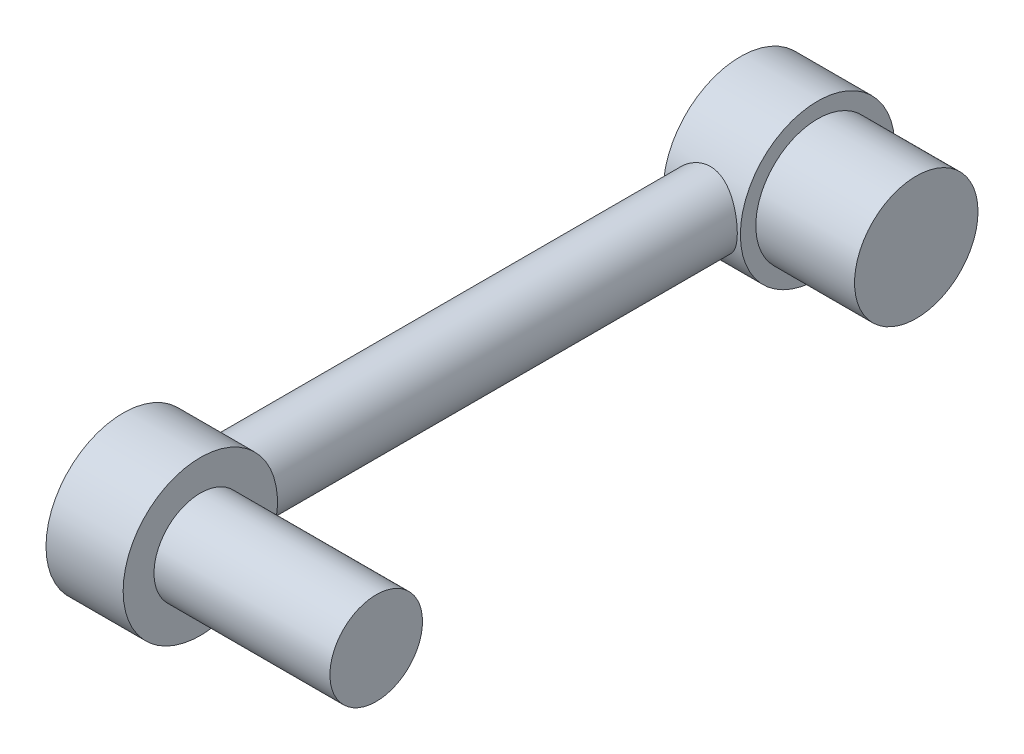
ISO-10303-21;
HEADER;
FILE_DESCRIPTION(('STEP AP214'),'2;1');
FILE_NAME('part.step','',(''),(''),'','','');
FILE_SCHEMA(('AUTOMOTIVE_DESIGN { 1 0 10303 214 1 1 1 1 }'));
ENDSEC;
DATA;
#1=APPLICATION_CONTEXT('core data for automotive mechanical design processes');
#2=APPLICATION_PROTOCOL_DEFINITION('international standard','automotive_design',2000,#1);
#3=PRODUCT_CONTEXT('',#1,'mechanical');
#4=PRODUCT('Part','Part','',(#3));
#5=PRODUCT_RELATED_PRODUCT_CATEGORY('part','',(#4));
#6=PRODUCT_DEFINITION_FORMATION('','',#4);
#7=PRODUCT_DEFINITION_CONTEXT('part definition',#1,'design');
#8=PRODUCT_DEFINITION('design','',#6,#7);
#9=PRODUCT_DEFINITION_SHAPE('','',#8);
#10=(LENGTH_UNIT() NAMED_UNIT(*) SI_UNIT(.MILLI.,.METRE.));
#11=(NAMED_UNIT(*) PLANE_ANGLE_UNIT() SI_UNIT($,.RADIAN.));
#12=(NAMED_UNIT(*) SI_UNIT($,.STERADIAN.) SOLID_ANGLE_UNIT());
#13=UNCERTAINTY_MEASURE_WITH_UNIT(LENGTH_MEASURE(1.E-05),#10,'distance_accuracy_value','');
#14=(GEOMETRIC_REPRESENTATION_CONTEXT(3) GLOBAL_UNCERTAINTY_ASSIGNED_CONTEXT((#13)) GLOBAL_UNIT_ASSIGNED_CONTEXT((#10,
#11,#12)) REPRESENTATION_CONTEXT('',''));
#15=CARTESIAN_POINT('',(0.,0.,0.));
#16=DIRECTION('',(0.,0.,1.));
#17=DIRECTION('',(1.,0.,0.));
#18=AXIS2_PLACEMENT_3D('',#15,#16,#17);
#19=CARTESIAN_POINT('',(32.7361157948856,-0.000155928265313106,229.842391562286));
#20=DIRECTION('',(0.,0.,-1.));
#21=DIRECTION('',(-1.,0.,0.));
#22=AXIS2_PLACEMENT_3D('',#19,#20,#21);
#23=CYLINDRICAL_SURFACE('',#22,1.1499977);
#24=CARTESIAN_POINT('',(31.5861180948856,-0.000155928265313106,214.342422562286));
#25=CARTESIAN_POINT('',(31.5861212940225,-0.0611779226632118,214.342419895527));
#26=CARTESIAN_POINT('',(31.5910037004324,-0.122289286232802,214.340163630268));
#27=CARTESIAN_POINT('',(31.6103339588543,-0.242741167368682,214.33136176787));
#28=CARTESIAN_POINT('',(31.624803558208,-0.302077337561268,214.324806419146));
#29=CARTESIAN_POINT('',(31.6626425692557,-0.417046997243302,214.308099701936));
#30=CARTESIAN_POINT('',(31.685979380962,-0.472693183014936,214.29796151506));
#31=CARTESIAN_POINT('',(31.7407387236926,-0.579214328200965,214.275047307762));
#32=CARTESIAN_POINT('',(31.7721597530581,-0.630090171323364,214.262271777319));
#33=CARTESIAN_POINT('',(31.8441246361183,-0.728694710872468,214.234491307803));
#34=CARTESIAN_POINT('',(31.8850668543527,-0.776109074989363,214.219403627967));
#35=CARTESIAN_POINT('',(31.9740634373665,-0.863679236492879,214.189011272788));
#36=CARTESIAN_POINT('',(32.0221223119728,-0.903830395077182,214.173706465452));
#37=CARTESIAN_POINT('',(32.1276343282329,-0.978250334418769,214.143518691891));
#38=CARTESIAN_POINT('',(32.1854882724892,-1.01199011605968,214.128722842286));
#39=CARTESIAN_POINT('',(32.3068183492792,-1.06912108339666,214.102578596174));
#40=CARTESIAN_POINT('',(32.3702909542921,-1.09251870759387,214.091228056174));
#41=CARTESIAN_POINT('',(32.4974571272264,-1.12693546037498,214.074174807812));
#42=CARTESIAN_POINT('',(32.5609471967483,-1.1385637301836,214.068196207122));
#43=CARTESIAN_POINT('',(32.6892364838053,-1.15099987666127,214.06179405775));
#44=CARTESIAN_POINT('',(32.7540346912098,-1.15181580481151,214.061366375546));
#45=CARTESIAN_POINT('',(32.8763459552984,-1.14305608442371,214.06588630947));
#46=CARTESIAN_POINT('',(32.9339543035729,-1.13448398489102,214.070314868478));
#47=CARTESIAN_POINT('',(33.0467993403038,-1.10890258309986,214.08315478937));
#48=CARTESIAN_POINT('',(33.1020354400409,-1.09189119946672,214.09156713375));
#49=CARTESIAN_POINT('',(33.2100900595002,-1.0495789637581,214.11162188806));
#50=CARTESIAN_POINT('',(33.2628241984485,-1.02409712512812,214.12333388477));
#51=CARTESIAN_POINT('',(33.3635002005382,-0.965699245157507,214.148661020577));
#52=CARTESIAN_POINT('',(33.4114399766514,-0.93277998638938,214.162276982356));
#53=CARTESIAN_POINT('',(33.5064731569571,-0.856392003813841,214.191613961581));
#54=CARTESIAN_POINT('',(33.5529475553316,-0.81217798869562,214.20740578304));
#55=CARTESIAN_POINT('',(33.6380553278823,-0.716467627708806,214.238131637056));
#56=CARTESIAN_POINT('',(33.676685988976,-0.664968772490304,214.253065371533));
#57=CARTESIAN_POINT('',(33.7462028558289,-0.553915854681603,214.281014811138));
#58=CARTESIAN_POINT('',(33.7767841660319,-0.494148802853364,214.293948908704));
#59=CARTESIAN_POINT('',(33.8272321821065,-0.369570601797948,214.315784632834));
#60=CARTESIAN_POINT('',(33.8471061252676,-0.304762893626292,214.324688982519));
#61=CARTESIAN_POINT('',(33.8741572212142,-0.177067107127812,214.336918494931));
#62=CARTESIAN_POINT('',(33.8821616628094,-0.114389164798268,214.340606252865));
#63=CARTESIAN_POINT('',(33.8877776487442,0.0115196751618334,214.343186952546));
#64=CARTESIAN_POINT('',(33.8853930687801,0.0747503578047698,214.342081682365));
#65=CARTESIAN_POINT('',(33.8708394139786,0.195740340692227,214.335426109938));
#66=CARTESIAN_POINT('',(33.8592982838349,0.253592863775202,214.33016116663));
#67=CARTESIAN_POINT('',(33.8276879763535,0.36645049264906,214.316050567843));
#68=CARTESIAN_POINT('',(33.8076177890521,0.421455260358906,214.307204488312));
#69=CARTESIAN_POINT('',(33.7589004235969,0.528993471292481,214.286413945324));
#70=CARTESIAN_POINT('',(33.7300075538628,0.581398170855333,214.274382248725));
#71=CARTESIAN_POINT('',(33.6647330263951,0.680802556540008,214.248443729346));
#72=CARTESIAN_POINT('',(33.6283480788375,0.727799854054084,214.234536083753));
#73=CARTESIAN_POINT('',(33.5455002358889,0.819307100733414,214.204833803892));
#74=CARTESIAN_POINT('',(33.4984410258123,0.86325908755019,214.188979581624));
#75=CARTESIAN_POINT('',(33.397458572602,0.942847679258826,214.158144493407));
#76=CARTESIAN_POINT('',(33.3435323341748,0.978480636183174,214.143164012754));
#77=CARTESIAN_POINT('',(33.2282414033324,1.04135338829136,214.115410807381));
#78=CARTESIAN_POINT('',(33.1667037843859,1.06831353485203,214.102716554844));
#79=CARTESIAN_POINT('',(33.0391858423811,1.11121972860194,214.08193581307));
#80=CARTESIAN_POINT('',(32.9732103476229,1.12717753995599,214.073844403903));
#81=CARTESIAN_POINT('',(32.844978671797,1.14634616359926,214.064051574948));
#82=CARTESIAN_POINT('',(32.7829110907323,1.15056137321624,214.061847378741));
#83=CARTESIAN_POINT('',(32.6589537395832,1.14892169620318,214.062697295569));
#84=CARTESIAN_POINT('',(32.59706392771,1.14306941048118,214.065750050486));
#85=CARTESIAN_POINT('',(32.4796684682154,1.12235846157425,214.076270673779));
#86=CARTESIAN_POINT('',(32.4240167555632,1.10814811960762,214.083419848877));
#87=CARTESIAN_POINT('',(32.3159075163981,1.07183927706818,214.101012496475));
#88=CARTESIAN_POINT('',(32.2634509370671,1.04973845059345,214.111456940226));
#89=CARTESIAN_POINT('',(32.159436829797,0.996622679473936,214.135309266104));
#90=CARTESIAN_POINT('',(32.1081648101249,0.965117465782031,214.148866765305));
#91=CARTESIAN_POINT('',(32.0113251870527,0.894696755782625,214.177090703845));
#92=CARTESIAN_POINT('',(31.9657601836044,0.8557779022412,214.191757643768));
#93=CARTESIAN_POINT('',(31.8770823308746,0.767210269152959,214.222242746672));
#94=CARTESIAN_POINT('',(31.8346291139305,0.7168888503911,214.238035616479));
#95=CARTESIAN_POINT('',(31.758678613251,0.609307474946216,214.267636455823));
#96=CARTESIAN_POINT('',(31.7251855227612,0.552044287740748,214.28144349462));
#97=CARTESIAN_POINT('',(31.6685426926376,0.43242951074661,214.305461957975));
#98=CARTESIAN_POINT('',(31.6453191168714,0.370118186710816,214.315698934182));
#99=CARTESIAN_POINT('',(31.6099455059651,0.24197213996583,214.331500770087));
#100=CARTESIAN_POINT('',(31.5977622572198,0.176148620275728,214.337079639177));
#101=CARTESIAN_POINT('',(31.5896292019046,0.091508470993113,214.340809349418));
#102=CARTESIAN_POINT('',(31.5883139024407,0.0732080521764844,214.341413148899));
#103=CARTESIAN_POINT('',(31.58655786002,0.0365558101279413,214.342220160013));
#104=CARTESIAN_POINT('',(31.5861171323494,0.0182039860031589,214.342423364644));
#105=CARTESIAN_POINT('',(31.5861180948856,-0.000155928265313106,214.342422562286));
#106=B_SPLINE_CURVE_WITH_KNOTS('',3,(#24,#25,#26,#27,#28,#29,#30,#31,#32,#33,#34,#35,#36,#37,
#38,#39,#40,#41,#42,#43,#44,#45,#46,#47,#48,#49,#50,#51,#52,#53,#54,#55,#56,#57,#58,#59,#60,#61,
#62,#63,#64,#65,#66,#67,#68,#69,#70,#71,#72,#73,#74,#75,#76,#77,#78,#79,#80,#81,#82,#83,#84,#85,
#86,#87,#88,#89,#90,#91,#92,#93,#94,#95,#96,#97,#98,#99,#100,#101,#102,#103,#104,#105),
.UNSPECIFIED.,.T.,.F.,(4,2,2,2,2,2,2,2,2,2,2,2,2,2,2,2,2,2,2,2,2,2,2,2,2,2,2,2,2,2,2,2,2,2,2,2,
2,2,2,2,4),(0.,0.182990818336192,0.366398155976994,0.549137627069028,0.731843178435686,
0.924330718353651,1.11694076384862,1.32166850213111,1.52626860720945,1.71963444597512,
1.91285628550153,2.0872743691555,2.26173549081949,2.44019359959979,2.61872905767257,
2.8160369080954,3.01341288981221,3.21744110883642,3.42133124818599,3.61020544486418,
3.79900918675092,3.97587978274815,4.15277132862017,4.33512462293481,4.51755816127222,
4.71561977086747,4.91376806976417,5.11778138594499,5.3215762226936,5.50730905536104,
5.6929939116991,5.86588508556435,6.03882726521757,6.22313201886133,6.40752043336424,
6.60968078823536,6.81193558718733,7.01271157559943,7.21288152681882,7.26793769220962,
7.32299481988498),.UNSPECIFIED.);
#107=CARTESIAN_POINT('',(31.5861180948856,-0.000155928265313106,214.342422562286));
#108=VERTEX_POINT('',#107);
#109=EDGE_CURVE('E78',#108,#108,#106,.T.);
#110=ORIENTED_EDGE('',*,*,#109,.T.);
#111=EDGE_LOOP('',(#110));
#112=FACE_BOUND('',#111,.T.);
#113=CARTESIAN_POINT('',(31.5861180948856,-0.000155928265313106,229.342392562286));
#114=CARTESIAN_POINT('',(31.5861212940225,-0.0611779226632098,229.342395229046));
#115=CARTESIAN_POINT('',(31.5910037004324,-0.122289286232798,229.344651494305));
#116=CARTESIAN_POINT('',(31.6103339588543,-0.242741167368679,229.353453356703));
#117=CARTESIAN_POINT('',(31.624803558208,-0.302077337561268,229.360008705427));
#118=CARTESIAN_POINT('',(31.6626425692557,-0.417046997243301,229.376715422637));
#119=CARTESIAN_POINT('',(31.685979380962,-0.47269318301493,229.386853609513));
#120=CARTESIAN_POINT('',(31.7407387236926,-0.57921432820096,229.40976781681));
#121=CARTESIAN_POINT('',(31.7721597530581,-0.630090171323365,229.422543347253));
#122=CARTESIAN_POINT('',(31.8441246361183,-0.728694710872468,229.45032381677));
#123=CARTESIAN_POINT('',(31.8850668543527,-0.776109074989355,229.465411496606));
#124=CARTESIAN_POINT('',(31.9740634373665,-0.863679236492871,229.495803851785));
#125=CARTESIAN_POINT('',(32.0221223119728,-0.90383039507718,229.51110865912));
#126=CARTESIAN_POINT('',(32.1276343282329,-0.978250334418767,229.541296432682));
#127=CARTESIAN_POINT('',(32.1854882724892,-1.01199011605967,229.556092282286));
#128=CARTESIAN_POINT('',(32.3068183492792,-1.06912108339665,229.582236528399));
#129=CARTESIAN_POINT('',(32.3702909542921,-1.09251870759386,229.593587068399));
#130=CARTESIAN_POINT('',(32.4974571272264,-1.12693546037498,229.61064031676));
#131=CARTESIAN_POINT('',(32.5609471967483,-1.13856373018359,229.616618917451));
#132=CARTESIAN_POINT('',(32.6892364838053,-1.15099987666127,229.623021066823));
#133=CARTESIAN_POINT('',(32.7540346912098,-1.15181580481151,229.623448749027));
#134=CARTESIAN_POINT('',(32.8763459552984,-1.14305608442371,229.618928815102));
#135=CARTESIAN_POINT('',(32.9339543035729,-1.13448398489101,229.614500256095));
#136=CARTESIAN_POINT('',(33.0467993403039,-1.10890258309986,229.601660335202));
#137=CARTESIAN_POINT('',(33.1020354400409,-1.09189119946672,229.593247990822));
#138=CARTESIAN_POINT('',(33.2100900595002,-1.0495789637581,229.573193236513));
#139=CARTESIAN_POINT('',(33.2628241984486,-1.02409712512812,229.561481239803));
#140=CARTESIAN_POINT('',(33.3635002005382,-0.965699245157507,229.536154103995));
#141=CARTESIAN_POINT('',(33.4114399766514,-0.93277998638938,229.522538142217));
#142=CARTESIAN_POINT('',(33.5064731569571,-0.856392003813837,229.493201162991));
#143=CARTESIAN_POINT('',(33.5529475553316,-0.812177988695611,229.477409341533));
#144=CARTESIAN_POINT('',(33.6380553278823,-0.716467627708799,229.446683487517));
#145=CARTESIAN_POINT('',(33.676685988976,-0.664968772490304,229.43174975304));
#146=CARTESIAN_POINT('',(33.7462028558289,-0.553915854681605,229.403800313435));
#147=CARTESIAN_POINT('',(33.7767841660319,-0.49414880285336,229.390866215868));
#148=CARTESIAN_POINT('',(33.8272321821065,-0.369570601797942,229.369030491738));
#149=CARTESIAN_POINT('',(33.8471061252676,-0.304762893626292,229.360126142054));
#150=CARTESIAN_POINT('',(33.8741572212142,-0.177067107127814,229.347896629642));
#151=CARTESIAN_POINT('',(33.8821616628094,-0.114389164798268,229.344208871708));
#152=CARTESIAN_POINT('',(33.8877776487442,0.0115196751618361,229.341628172027));
#153=CARTESIAN_POINT('',(33.8853930687801,0.0747503578047717,229.342733442207));
#154=CARTESIAN_POINT('',(33.8708394139786,0.195740340692226,229.349389014635));
#155=CARTESIAN_POINT('',(33.8592982838349,0.253592863775199,229.354653957943));
#156=CARTESIAN_POINT('',(33.8276879763535,0.366450492649057,229.36876455673));
#157=CARTESIAN_POINT('',(33.8076177890521,0.421455260358906,229.377610636261));
#158=CARTESIAN_POINT('',(33.7589004235969,0.528993471292476,229.398401179248));
#159=CARTESIAN_POINT('',(33.7300075538628,0.581398170855322,229.410432875848));
#160=CARTESIAN_POINT('',(33.6647330263951,0.680802556539997,229.436371395226));
#161=CARTESIAN_POINT('',(33.6283480788375,0.727799854054079,229.45027904082));
#162=CARTESIAN_POINT('',(33.5455002358889,0.819307100733412,229.47998132068));
#163=CARTESIAN_POINT('',(33.4984410258123,0.863259087550186,229.495835542949));
#164=CARTESIAN_POINT('',(33.397458572602,0.942847679258822,229.526670631165));
#165=CARTESIAN_POINT('',(33.3435323341748,0.978480636183174,229.541651111819));
#166=CARTESIAN_POINT('',(33.2282414033324,1.04135338829136,229.569404317191));
#167=CARTESIAN_POINT('',(33.1667037843859,1.06831353485203,229.582098569729));
#168=CARTESIAN_POINT('',(33.0391858423811,1.11121972860193,229.602879311502));
#169=CARTESIAN_POINT('',(32.9732103476229,1.12717753995599,229.610970720669));
#170=CARTESIAN_POINT('',(32.844978671797,1.14634616359927,229.620763549625));
#171=CARTESIAN_POINT('',(32.7829110907323,1.15056137321624,229.622967745832));
#172=CARTESIAN_POINT('',(32.6589537395832,1.14892169620318,229.622117829004));
#173=CARTESIAN_POINT('',(32.59706392771,1.14306941048118,229.619065074087));
#174=CARTESIAN_POINT('',(32.4796684682154,1.12235846157425,229.608544450794));
#175=CARTESIAN_POINT('',(32.4240167555632,1.10814811960762,229.601395275696));
#176=CARTESIAN_POINT('',(32.3159075163981,1.07183927706818,229.583802628098));
#177=CARTESIAN_POINT('',(32.2634509370672,1.04973845059345,229.573358184347));
#178=CARTESIAN_POINT('',(32.159436829797,0.996622679473936,229.549505858469));
#179=CARTESIAN_POINT('',(32.1081648101249,0.965117465782026,229.535948359267));
#180=CARTESIAN_POINT('',(32.0113251870527,0.894696755782621,229.507724420728));
#181=CARTESIAN_POINT('',(31.9657601836044,0.855777902241202,229.493057480805));
#182=CARTESIAN_POINT('',(31.8770823308746,0.767210269152962,229.462572377901));
#183=CARTESIAN_POINT('',(31.8346291139305,0.716888850391099,229.446779508094));
#184=CARTESIAN_POINT('',(31.758678613251,0.609307474946214,229.417178668749));
#185=CARTESIAN_POINT('',(31.7251855227612,0.55204428774075,229.403371629953));
#186=CARTESIAN_POINT('',(31.6685426926376,0.432429510746613,229.379353166598));
#187=CARTESIAN_POINT('',(31.6453191168714,0.370118186710815,229.36911619039));
#188=CARTESIAN_POINT('',(31.6099455059651,0.241972139965829,229.353314354486));
#189=CARTESIAN_POINT('',(31.5977622572198,0.17614862027573,229.347735485395));
#190=CARTESIAN_POINT('',(31.5896292019046,0.0915084709931135,229.344005775154));
#191=CARTESIAN_POINT('',(31.5883139024407,0.0732080521764842,229.343401975674));
#192=CARTESIAN_POINT('',(31.58655786002,0.0365558101279406,229.34259496456));
#193=CARTESIAN_POINT('',(31.5861171323494,0.0182039860031585,229.342391759928));
#194=CARTESIAN_POINT('',(31.5861180948856,-0.000155928265313106,229.342392562286));
#195=B_SPLINE_CURVE_WITH_KNOTS('',3,(#113,#114,#115,#116,#117,#118,#119,#120,#121,#122,#123,
#124,#125,#126,#127,#128,#129,#130,#131,#132,#133,#134,#135,#136,#137,#138,#139,#140,#141,#142,
#143,#144,#145,#146,#147,#148,#149,#150,#151,#152,#153,#154,#155,#156,#157,#158,#159,#160,#161,
#162,#163,#164,#165,#166,#167,#168,#169,#170,#171,#172,#173,#174,#175,#176,#177,#178,#179,#180,
#181,#182,#183,#184,#185,#186,#187,#188,#189,#190,#191,#192,#193,#194),.UNSPECIFIED.,.T.,.F.,(4,
2,2,2,2,2,2,2,2,2,2,2,2,2,2,2,2,2,2,2,2,2,2,2,2,2,2,2,2,2,2,2,2,2,2,2,2,2,2,2,4),(0.,
0.18299081833619,0.366398155976993,0.549137627069027,0.731843178435677,0.92433071835364,
1.11694076384861,1.32166850213108,1.52626860720945,1.71963444597513,1.91285628550153,
2.08727436915551,2.2617354908195,2.44019359959979,2.61872905767256,2.81603690809541,
3.01341288981222,3.21744110883642,3.42133124818599,3.61020544486418,3.79900918675092,
3.97587978274815,4.15277132862017,4.3351246229348,4.51755816127223,4.71561977086747,
4.91376806976416,5.11778138594499,5.3215762226936,5.50730905536104,5.69299391169911,
5.86588508556435,6.03882726521758,6.22313201886133,6.40752043336426,6.60968078823536,
6.81193558718734,7.01271157559943,7.21288152681883,7.26793769220962,7.32299481988498),.UNSPECIFIED.);
#196=CARTESIAN_POINT('',(31.5861180948856,-0.000155928265313106,229.342392562286));
#197=VERTEX_POINT('',#196);
#198=EDGE_CURVE('E43',#197,#197,#195,.T.);
#199=ORIENTED_EDGE('',*,*,#198,.F.);
#200=EDGE_LOOP('',(#199));
#201=FACE_BOUND('',#200,.T.);
#202=ADVANCED_FACE('F39',(#112,#201),#23,.T.);
#203=CARTESIAN_POINT('',(31.4861182948856,-0.000155928265313106,211.842427562286));
#204=DIRECTION('',(-1.,0.,0.));
#205=DIRECTION('',(0.,0.,1.));
#206=AXIS2_PLACEMENT_3D('',#203,#204,#205);
#207=CYLINDRICAL_SURFACE('',#206,2.499995);
#208=CARTESIAN_POINT('',(33.9861132948856,-0.000155928265313106,211.842427562286));
#209=DIRECTION('',(-1.,0.,0.));
#210=DIRECTION('',(0.,0.,1.));
#211=AXIS2_PLACEMENT_3D('',#208,#209,#210);
#212=CIRCLE('',#211,2.499995);
#213=CARTESIAN_POINT('',(33.9861132948856,-0.000155928265313106,214.342422562286));
#214=VERTEX_POINT('',#213);
#215=EDGE_CURVE('E75',#214,#214,#212,.T.);
#216=ORIENTED_EDGE('',*,*,#215,.T.);
#217=EDGE_LOOP('',(#216));
#218=FACE_BOUND('',#217,.T.);
#219=CARTESIAN_POINT('',(31.4861182948856,-0.000155928265313106,211.842427562286));
#220=DIRECTION('',(-1.,0.,0.));
#221=DIRECTION('',(0.,0.,1.));
#222=AXIS2_PLACEMENT_3D('',#219,#220,#221);
#223=CIRCLE('',#222,2.499995);
#224=CARTESIAN_POINT('',(31.4861182948856,-0.000155928265313106,214.342422562286));
#225=VERTEX_POINT('',#224);
#226=EDGE_CURVE('E81',#225,#225,#223,.T.);
#227=ORIENTED_EDGE('',*,*,#226,.F.);
#228=EDGE_LOOP('',(#227));
#229=FACE_BOUND('',#228,.T.);
#230=ORIENTED_EDGE('',*,*,#109,.F.);
#231=EDGE_LOOP('',(#230));
#232=FACE_BOUND('',#231,.T.);
#233=ADVANCED_FACE('F88',(#218,#229,#232),#207,.T.);
#234=CARTESIAN_POINT('',(31.4861182948856,-0.000155928265313106,211.842427562286));
#235=DIRECTION('',(-1.,0.,0.));
#236=DIRECTION('',(0.,0.,1.));
#237=AXIS2_PLACEMENT_3D('',#234,#235,#236);
#238=PLANE('',#237);
#239=CARTESIAN_POINT('',(31.4861182948856,-0.000155928265313106,211.842427562286));
#240=DIRECTION('',(-1.,0.,0.));
#241=DIRECTION('',(0.,0.,1.));
#242=AXIS2_PLACEMENT_3D('',#239,#240,#241);
#243=CIRCLE('',#242,1.999996);
#244=CARTESIAN_POINT('',(31.4861182948856,-0.000155928265313106,213.842423562286));
#245=VERTEX_POINT('',#244);
#246=EDGE_CURVE('E64',#245,#245,#243,.T.);
#247=ORIENTED_EDGE('',*,*,#246,.F.);
#248=EDGE_LOOP('',(#247));
#249=FACE_BOUND('',#248,.T.);
#250=ORIENTED_EDGE('',*,*,#226,.T.);
#251=EDGE_LOOP('',(#250));
#252=FACE_BOUND('',#251,.T.);
#253=ADVANCED_FACE('F92',(#249,#252),#238,.T.);
#254=CARTESIAN_POINT('',(33.9861132948856,-0.000155928265313106,211.842427562286));
#255=DIRECTION('',(1.,0.,0.));
#256=DIRECTION('',(0.,0.,-1.));
#257=AXIS2_PLACEMENT_3D('',#254,#255,#256);
#258=PLANE('',#257);
#259=CARTESIAN_POINT('',(33.9861132948856,-0.000155928265313106,211.842427562286));
#260=DIRECTION('',(1.,0.,0.));
#261=DIRECTION('',(0.,0.,-1.));
#262=AXIS2_PLACEMENT_3D('',#259,#260,#261);
#263=CIRCLE('',#262,1.999996);
#264=CARTESIAN_POINT('',(33.9861132948856,-0.000155928265313106,209.842431562286));
#265=VERTEX_POINT('',#264);
#266=EDGE_CURVE('E55',#265,#265,#263,.T.);
#267=ORIENTED_EDGE('',*,*,#266,.F.);
#268=EDGE_LOOP('',(#267));
#269=FACE_BOUND('',#268,.T.);
#270=ORIENTED_EDGE('',*,*,#215,.F.);
#271=EDGE_LOOP('',(#270));
#272=FACE_BOUND('',#271,.T.);
#273=ADVANCED_FACE('F94',(#269,#272),#258,.T.);
#274=CARTESIAN_POINT('',(37.1861068948856,-0.000155928265313106,211.842427562286));
#275=DIRECTION('',(-1.,0.,0.));
#276=DIRECTION('',(0.,0.,1.));
#277=AXIS2_PLACEMENT_3D('',#274,#275,#276);
#278=CYLINDRICAL_SURFACE('',#277,1.999996);
#279=CARTESIAN_POINT('',(37.1861068948856,-0.000155928265313106,211.842427562286));
#280=DIRECTION('',(1.,0.,0.));
#281=DIRECTION('',(0.,0.,-1.));
#282=AXIS2_PLACEMENT_3D('',#279,#280,#281);
#283=CIRCLE('',#282,1.999996);
#284=CARTESIAN_POINT('',(37.1861068948856,-0.000155928265313106,209.842431562286));
#285=VERTEX_POINT('',#284);
#286=EDGE_CURVE('E72',#285,#285,#283,.T.);
#287=ORIENTED_EDGE('',*,*,#286,.F.);
#288=EDGE_LOOP('',(#287));
#289=FACE_BOUND('',#288,.T.);
#290=ORIENTED_EDGE('',*,*,#266,.T.);
#291=EDGE_LOOP('',(#290));
#292=FACE_BOUND('',#291,.T.);
#293=ADVANCED_FACE('F101',(#289,#292),#278,.T.);
#294=CARTESIAN_POINT('',(37.1861068948856,-0.000155928265313106,211.842427562286));
#295=DIRECTION('',(1.,0.,0.));
#296=DIRECTION('',(0.,0.,-1.));
#297=AXIS2_PLACEMENT_3D('',#294,#295,#296);
#298=PLANE('',#297);
#299=ORIENTED_EDGE('',*,*,#286,.T.);
#300=EDGE_LOOP('',(#299));
#301=FACE_BOUND('',#300,.T.);
#302=ADVANCED_FACE('F116',(#301),#298,.T.);
#303=CARTESIAN_POINT('',(31.4861182948856,-0.000155928265313106,231.842387562286));
#304=DIRECTION('',(-1.,0.,0.));
#305=DIRECTION('',(0.,0.,1.));
#306=AXIS2_PLACEMENT_3D('',#303,#304,#305);
#307=CYLINDRICAL_SURFACE('',#306,2.499995);
#308=CARTESIAN_POINT('',(33.9861132948856,-0.000155928265313106,231.842387562286));
#309=DIRECTION('',(-1.,0.,0.));
#310=DIRECTION('',(0.,0.,1.));
#311=AXIS2_PLACEMENT_3D('',#308,#309,#310);
#312=CIRCLE('',#311,2.499995);
#313=CARTESIAN_POINT('',(33.9861132948856,-0.000155928265313106,234.342382562286));
#314=VERTEX_POINT('',#313);
#315=EDGE_CURVE('E69',#314,#314,#312,.T.);
#316=ORIENTED_EDGE('',*,*,#315,.T.);
#317=EDGE_LOOP('',(#316));
#318=FACE_BOUND('',#317,.T.);
#319=CARTESIAN_POINT('',(31.4861182948856,-0.000155928265313106,231.842387562286));
#320=DIRECTION('',(-1.,0.,0.));
#321=DIRECTION('',(0.,0.,1.));
#322=AXIS2_PLACEMENT_3D('',#319,#320,#321);
#323=CIRCLE('',#322,2.499995);
#324=CARTESIAN_POINT('',(31.4861182948856,-0.000155928265313106,234.342382562286));
#325=VERTEX_POINT('',#324);
#326=EDGE_CURVE('E63',#325,#325,#323,.T.);
#327=ORIENTED_EDGE('',*,*,#326,.F.);
#328=EDGE_LOOP('',(#327));
#329=FACE_BOUND('',#328,.T.);
#330=ORIENTED_EDGE('',*,*,#198,.T.);
#331=EDGE_LOOP('',(#330));
#332=FACE_BOUND('',#331,.T.);
#333=ADVANCED_FACE('F113',(#318,#329,#332),#307,.T.);
#334=CARTESIAN_POINT('',(31.4861182948856,-0.000155928265313106,229.342392562286));
#335=DIRECTION('',(1.,0.,0.));
#336=DIRECTION('',(0.,0.,-1.));
#337=AXIS2_PLACEMENT_3D('',#334,#335,#336);
#338=PLANE('',#337);
#339=CARTESIAN_POINT('',(31.4861182948856,-0.000155928265313106,231.842387562286));
#340=DIRECTION('',(-1.,0.,0.));
#341=DIRECTION('',(0.,0.,1.));
#342=AXIS2_PLACEMENT_3D('',#339,#340,#341);
#343=CIRCLE('',#342,1.499997);
#344=CARTESIAN_POINT('',(31.4861182948856,-0.000155928265313106,233.342384562286));
#345=VERTEX_POINT('',#344);
#346=EDGE_CURVE('E238',#345,#345,#343,.T.);
#347=ORIENTED_EDGE('',*,*,#346,.F.);
#348=EDGE_LOOP('',(#347));
#349=FACE_BOUND('',#348,.T.);
#350=ORIENTED_EDGE('',*,*,#326,.T.);
#351=EDGE_LOOP('',(#350));
#352=FACE_BOUND('',#351,.T.);
#353=ADVANCED_FACE('F115',(#349,#352),#338,.F.);
#354=CARTESIAN_POINT('',(33.9861132948856,-0.000155928265313106,229.342392562286));
#355=DIRECTION('',(-1.,0.,0.));
#356=DIRECTION('',(0.,0.,1.));
#357=AXIS2_PLACEMENT_3D('',#354,#355,#356);
#358=PLANE('',#357);
#359=CARTESIAN_POINT('',(33.9861132948856,-0.000155928265313106,231.842387562286));
#360=DIRECTION('',(1.,0.,0.));
#361=DIRECTION('',(0.,0.,-1.));
#362=AXIS2_PLACEMENT_3D('',#359,#360,#361);
#363=CIRCLE('',#362,1.499997);
#364=CARTESIAN_POINT('',(33.9861132948856,-0.000155928265313106,230.342390562286));
#365=VERTEX_POINT('',#364);
#366=EDGE_CURVE('E10',#365,#365,#363,.T.);
#367=ORIENTED_EDGE('',*,*,#366,.F.);
#368=EDGE_LOOP('',(#367));
#369=FACE_BOUND('',#368,.T.);
#370=ORIENTED_EDGE('',*,*,#315,.F.);
#371=EDGE_LOOP('',(#370));
#372=FACE_BOUND('',#371,.T.);
#373=ADVANCED_FACE('F122',(#369,#372),#358,.F.);
#374=CARTESIAN_POINT('',(33.0861150948856,-0.000155928265313106,211.842427562286));
#375=DIRECTION('',(-1.,0.,0.));
#376=DIRECTION('',(0.,0.,1.));
#377=AXIS2_PLACEMENT_3D('',#374,#375,#376);
#378=CYLINDRICAL_SURFACE('',#377,1.999996);
#379=CARTESIAN_POINT('',(33.0861150948856,-0.000155928265313106,211.842427562286));
#380=DIRECTION('',(-1.,0.,0.));
#381=DIRECTION('',(0.,0.,1.));
#382=AXIS2_PLACEMENT_3D('',#379,#380,#381);
#383=CIRCLE('',#382,1.999996);
#384=CARTESIAN_POINT('',(33.0861150948856,-0.000155928265313106,213.842423562286));
#385=VERTEX_POINT('',#384);
#386=EDGE_CURVE('E60',#385,#385,#383,.T.);
#387=ORIENTED_EDGE('',*,*,#386,.F.);
#388=EDGE_LOOP('',(#387));
#389=FACE_BOUND('',#388,.T.);
#390=ORIENTED_EDGE('',*,*,#246,.T.);
#391=EDGE_LOOP('',(#390));
#392=FACE_BOUND('',#391,.T.);
#393=ADVANCED_FACE('F131',(#389,#392),#378,.F.);
#394=CARTESIAN_POINT('',(33.0861150948856,-0.000155928265313106,211.842427562286));
#395=DIRECTION('',(-1.,0.,0.));
#396=DIRECTION('',(0.,0.,1.));
#397=AXIS2_PLACEMENT_3D('',#394,#395,#396);
#398=PLANE('',#397);
#399=ORIENTED_EDGE('',*,*,#386,.T.);
#400=EDGE_LOOP('',(#399));
#401=FACE_BOUND('',#400,.T.);
#402=ADVANCED_FACE('F184',(#401),#398,.T.);
#403=CARTESIAN_POINT('',(39.6861018948856,-0.000155928265313106,231.842387562286));
#404=DIRECTION('',(-1.,0.,0.));
#405=DIRECTION('',(0.,0.,1.));
#406=AXIS2_PLACEMENT_3D('',#403,#404,#405);
#407=CYLINDRICAL_SURFACE('',#406,1.499997);
#408=CARTESIAN_POINT('',(39.6861018948856,-0.000155928265313106,231.842387562286));
#409=DIRECTION('',(1.,0.,0.));
#410=DIRECTION('',(0.,0.,-1.));
#411=AXIS2_PLACEMENT_3D('',#408,#409,#410);
#412=CIRCLE('',#411,1.499997);
#413=CARTESIAN_POINT('',(39.6861018948856,-0.000155928265313106,230.342390562286));
#414=VERTEX_POINT('',#413);
#415=EDGE_CURVE('E58',#414,#414,#412,.T.);
#416=ORIENTED_EDGE('',*,*,#415,.F.);
#417=EDGE_LOOP('',(#416));
#418=FACE_BOUND('',#417,.T.);
#419=ORIENTED_EDGE('',*,*,#366,.T.);
#420=EDGE_LOOP('',(#419));
#421=FACE_BOUND('',#420,.T.);
#422=ADVANCED_FACE('F193',(#418,#421),#407,.T.);
#423=CARTESIAN_POINT('',(39.6861018948856,-0.000155928265313106,231.842387562286));
#424=DIRECTION('',(1.,0.,0.));
#425=DIRECTION('',(0.,0.,-1.));
#426=AXIS2_PLACEMENT_3D('',#423,#424,#425);
#427=PLANE('',#426);
#428=ORIENTED_EDGE('',*,*,#415,.T.);
#429=EDGE_LOOP('',(#428));
#430=FACE_BOUND('',#429,.T.);
#431=ADVANCED_FACE('F202',(#430),#427,.T.);
#432=CARTESIAN_POINT('',(31.9861172948856,-0.000155928265313106,231.842387562286));
#433=DIRECTION('',(-1.,0.,0.));
#434=DIRECTION('',(0.,0.,1.));
#435=AXIS2_PLACEMENT_3D('',#432,#433,#434);
#436=CYLINDRICAL_SURFACE('',#435,1.499997);
#437=CARTESIAN_POINT('',(31.9861172948856,-0.000155928265313106,231.842387562286));
#438=DIRECTION('',(-1.,0.,0.));
#439=DIRECTION('',(0.,0.,1.));
#440=AXIS2_PLACEMENT_3D('',#437,#438,#439);
#441=CIRCLE('',#440,1.499997);
#442=CARTESIAN_POINT('',(31.9861172948856,-0.000155928265313106,233.342384562286));
#443=VERTEX_POINT('',#442);
#444=EDGE_CURVE('E237',#443,#443,#441,.T.);
#445=ORIENTED_EDGE('',*,*,#444,.F.);
#446=EDGE_LOOP('',(#445));
#447=FACE_BOUND('',#446,.T.);
#448=ORIENTED_EDGE('',*,*,#346,.T.);
#449=EDGE_LOOP('',(#448));
#450=FACE_BOUND('',#449,.T.);
#451=ADVANCED_FACE('F212',(#447,#450),#436,.F.);
#452=CARTESIAN_POINT('',(31.9861172948856,-0.000155928265313106,231.842387562286));
#453=DIRECTION('',(-1.,0.,0.));
#454=DIRECTION('',(0.,0.,1.));
#455=AXIS2_PLACEMENT_3D('',#452,#453,#454);
#456=PLANE('',#455);
#457=ORIENTED_EDGE('',*,*,#444,.T.);
#458=EDGE_LOOP('',(#457));
#459=FACE_BOUND('',#458,.T.);
#460=ADVANCED_FACE('F222',(#459),#456,.T.);
#461=CLOSED_SHELL('',(#202,#233,#253,#273,#293,#302,#333,#353,#373,#393,#402,#422,#431,#451,#460));
#462=MANIFOLD_SOLID_BREP('B2',#461);
#463=ADVANCED_BREP_SHAPE_REPRESENTATION('',(#18,#462),#14);
#464=SHAPE_DEFINITION_REPRESENTATION(#9,#463);
ENDSEC;
END-ISO-10303-21;
